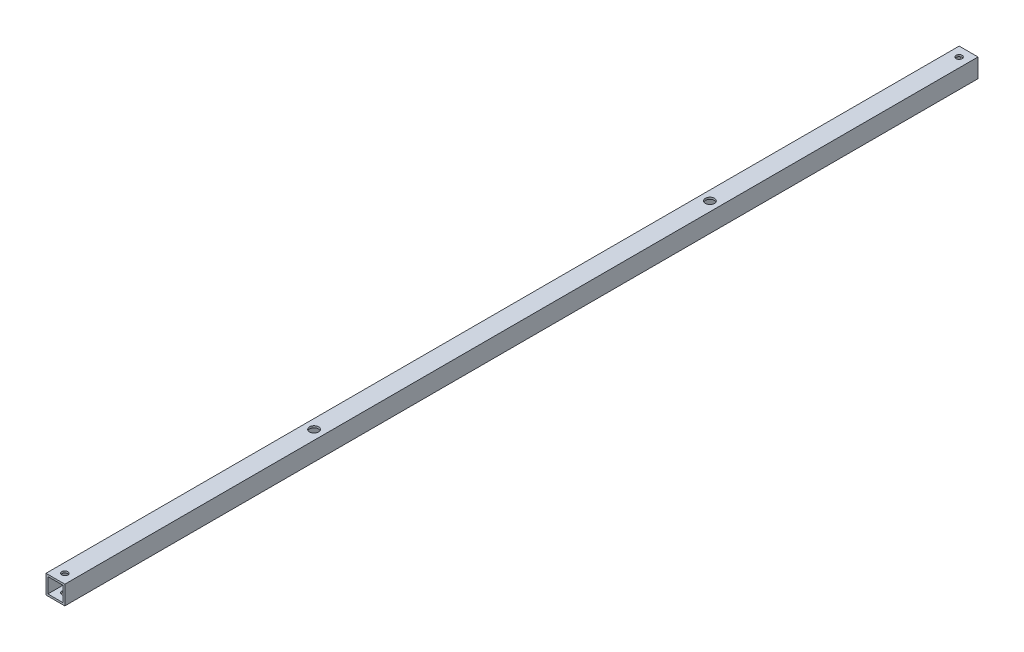
ISO-10303-21;
HEADER;
FILE_DESCRIPTION(('STEP AP214'),'2;1');
FILE_NAME('part.step','',(''),(''),'','','');
FILE_SCHEMA(('AUTOMOTIVE_DESIGN { 1 0 10303 214 1 1 1 1 }'));
ENDSEC;
DATA;
#1=APPLICATION_CONTEXT('core data for automotive mechanical design processes');
#2=APPLICATION_PROTOCOL_DEFINITION('international standard','automotive_design',2000,#1);
#3=PRODUCT_CONTEXT('',#1,'mechanical');
#4=PRODUCT('Part','Part','',(#3));
#5=PRODUCT_RELATED_PRODUCT_CATEGORY('part','',(#4));
#6=PRODUCT_DEFINITION_FORMATION('','',#4);
#7=PRODUCT_DEFINITION_CONTEXT('part definition',#1,'design');
#8=PRODUCT_DEFINITION('design','',#6,#7);
#9=PRODUCT_DEFINITION_SHAPE('','',#8);
#10=(LENGTH_UNIT() NAMED_UNIT(*) SI_UNIT(.MILLI.,.METRE.));
#11=(NAMED_UNIT(*) PLANE_ANGLE_UNIT() SI_UNIT($,.RADIAN.));
#12=(NAMED_UNIT(*) SI_UNIT($,.STERADIAN.) SOLID_ANGLE_UNIT());
#13=UNCERTAINTY_MEASURE_WITH_UNIT(LENGTH_MEASURE(1.E-05),#10,'distance_accuracy_value','');
#14=(GEOMETRIC_REPRESENTATION_CONTEXT(3) GLOBAL_UNCERTAINTY_ASSIGNED_CONTEXT((#13)) GLOBAL_UNIT_ASSIGNED_CONTEXT((#10,
#11,#12)) REPRESENTATION_CONTEXT('',''));
#15=CARTESIAN_POINT('',(0.,0.,0.));
#16=DIRECTION('',(0.,0.,1.));
#17=DIRECTION('',(1.,0.,0.));
#18=AXIS2_PLACEMENT_3D('',#15,#16,#17);
#19=CARTESIAN_POINT('',(0.,0.,0.));
#20=DIRECTION('',(0.,0.,-1.));
#21=DIRECTION('',(-1.,0.,0.));
#22=AXIS2_PLACEMENT_3D('',#19,#20,#21);
#23=PLANE('',#22);
#24=DIRECTION('',(0.,-1.,0.));
#25=VECTOR('',#24,1.);
#26=CARTESIAN_POINT('',(0.,0.,0.));
#27=LINE('',#26,#25);
#28=CARTESIAN_POINT('',(0.,10.,0.));
#29=VERTEX_POINT('',#28);
#30=CARTESIAN_POINT('',(0.,0.,0.));
#31=VERTEX_POINT('',#30);
#32=EDGE_CURVE('E110',#29,#31,#27,.T.);
#33=ORIENTED_EDGE('',*,*,#32,.F.);
#34=DIRECTION('',(-1.,0.,0.));
#35=VECTOR('',#34,1.);
#36=CARTESIAN_POINT('',(0.,10.,0.));
#37=LINE('',#36,#35);
#38=CARTESIAN_POINT('',(10.,10.,0.));
#39=VERTEX_POINT('',#38);
#40=EDGE_CURVE('E58',#39,#29,#37,.T.);
#41=ORIENTED_EDGE('',*,*,#40,.F.);
#42=DIRECTION('',(0.,1.,0.));
#43=VECTOR('',#42,1.);
#44=CARTESIAN_POINT('',(10.,0.,0.));
#45=LINE('',#44,#43);
#46=CARTESIAN_POINT('',(10.,0.,0.));
#47=VERTEX_POINT('',#46);
#48=EDGE_CURVE('E186',#47,#39,#45,.T.);
#49=ORIENTED_EDGE('',*,*,#48,.F.);
#50=DIRECTION('',(1.,0.,0.));
#51=VECTOR('',#50,1.);
#52=CARTESIAN_POINT('',(0.,0.,0.));
#53=LINE('',#52,#51);
#54=EDGE_CURVE('E184',#31,#47,#53,.T.);
#55=ORIENTED_EDGE('',*,*,#54,.F.);
#56=EDGE_LOOP('',(#33,#41,#49,#55));
#57=FACE_BOUND('',#56,.T.);
#58=DIRECTION('',(-1.,0.,0.));
#59=VECTOR('',#58,1.);
#60=CARTESIAN_POINT('',(1.,9.,0.));
#61=LINE('',#60,#59);
#62=CARTESIAN_POINT('',(9.,9.,0.));
#63=VERTEX_POINT('',#62);
#64=CARTESIAN_POINT('',(1.,9.,0.));
#65=VERTEX_POINT('',#64);
#66=EDGE_CURVE('E175',#63,#65,#61,.T.);
#67=ORIENTED_EDGE('',*,*,#66,.T.);
#68=DIRECTION('',(0.,-1.,0.));
#69=VECTOR('',#68,1.);
#70=CARTESIAN_POINT('',(1.,1.,0.));
#71=LINE('',#70,#69);
#72=CARTESIAN_POINT('',(1.,1.,0.));
#73=VERTEX_POINT('',#72);
#74=EDGE_CURVE('E50',#65,#73,#71,.T.);
#75=ORIENTED_EDGE('',*,*,#74,.T.);
#76=DIRECTION('',(1.,0.,0.));
#77=VECTOR('',#76,1.);
#78=CARTESIAN_POINT('',(1.,1.,0.));
#79=LINE('',#78,#77);
#80=CARTESIAN_POINT('',(9.,1.,0.));
#81=VERTEX_POINT('',#80);
#82=EDGE_CURVE('E109',#73,#81,#79,.T.);
#83=ORIENTED_EDGE('',*,*,#82,.T.);
#84=DIRECTION('',(0.,1.,0.));
#85=VECTOR('',#84,1.);
#86=CARTESIAN_POINT('',(9.,1.,0.));
#87=LINE('',#86,#85);
#88=EDGE_CURVE('E172',#81,#63,#87,.T.);
#89=ORIENTED_EDGE('',*,*,#88,.T.);
#90=EDGE_LOOP('',(#67,#75,#83,#89));
#91=FACE_BOUND('',#90,.T.);
#92=ADVANCED_FACE('F33',(#57,#91),#23,.T.);
#93=CARTESIAN_POINT('',(0.,0.,242.228968081884));
#94=DIRECTION('',(1.,0.,0.));
#95=DIRECTION('',(0.,0.,-1.));
#96=AXIS2_PLACEMENT_3D('',#93,#94,#95);
#97=PLANE('',#96);
#98=ORIENTED_EDGE('',*,*,#32,.T.);
#99=DIRECTION('',(0.,0.,-1.));
#100=VECTOR('',#99,1.);
#101=CARTESIAN_POINT('',(0.,0.,242.228968081884));
#102=LINE('',#101,#100);
#103=CARTESIAN_POINT('',(0.,0.,484.457936163769));
#104=VERTEX_POINT('',#103);
#105=EDGE_CURVE('E11',#104,#31,#102,.T.);
#106=ORIENTED_EDGE('',*,*,#105,.F.);
#107=DIRECTION('',(0.,-1.,0.));
#108=VECTOR('',#107,1.);
#109=CARTESIAN_POINT('',(0.,0.,484.457936163769));
#110=LINE('',#109,#108);
#111=CARTESIAN_POINT('',(0.,10.,484.457936163769));
#112=VERTEX_POINT('',#111);
#113=EDGE_CURVE('E131',#112,#104,#110,.T.);
#114=ORIENTED_EDGE('',*,*,#113,.F.);
#115=DIRECTION('',(0.,0.,-1.));
#116=VECTOR('',#115,1.);
#117=CARTESIAN_POINT('',(0.,10.,242.228968081884));
#118=LINE('',#117,#116);
#119=EDGE_CURVE('E189',#112,#29,#118,.T.);
#120=ORIENTED_EDGE('',*,*,#119,.T.);
#121=EDGE_LOOP('',(#98,#106,#114,#120));
#122=FACE_BOUND('',#121,.T.);
#123=ADVANCED_FACE('F35',(#122),#97,.F.);
#124=CARTESIAN_POINT('',(0.,0.,242.228968081884));
#125=DIRECTION('',(0.,1.,0.));
#126=DIRECTION('',(0.,0.,1.));
#127=AXIS2_PLACEMENT_3D('',#124,#125,#126);
#128=PLANE('',#127);
#129=CARTESIAN_POINT('',(5.,0.,5.));
#130=DIRECTION('',(0.,1.,0.));
#131=DIRECTION('',(0.,0.,1.));
#132=AXIS2_PLACEMENT_3D('',#129,#130,#131);
#133=CIRCLE('',#132,1.6);
#134=CARTESIAN_POINT('',(5.,0.,6.6));
#135=VERTEX_POINT('',#134);
#136=EDGE_CURVE('E152',#135,#135,#133,.T.);
#137=ORIENTED_EDGE('',*,*,#136,.T.);
#138=EDGE_LOOP('',(#137));
#139=FACE_BOUND('',#138,.T.);
#140=CARTESIAN_POINT('',(5.,0.,137.228968081884));
#141=DIRECTION('',(0.,1.,0.));
#142=DIRECTION('',(0.,0.,1.));
#143=AXIS2_PLACEMENT_3D('',#140,#141,#142);
#144=CIRCLE('',#143,2.40000000000001);
#145=CARTESIAN_POINT('',(5.,0.,139.628968081884));
#146=VERTEX_POINT('',#145);
#147=EDGE_CURVE('E159',#146,#146,#144,.T.);
#148=ORIENTED_EDGE('',*,*,#147,.T.);
#149=EDGE_LOOP('',(#148));
#150=FACE_BOUND('',#149,.T.);
#151=ORIENTED_EDGE('',*,*,#54,.T.);
#152=DIRECTION('',(0.,0.,-1.));
#153=VECTOR('',#152,1.);
#154=CARTESIAN_POINT('',(10.,0.,242.228968081884));
#155=LINE('',#154,#153);
#156=CARTESIAN_POINT('',(10.,0.,484.457936163769));
#157=VERTEX_POINT('',#156);
#158=EDGE_CURVE('E42',#157,#47,#155,.T.);
#159=ORIENTED_EDGE('',*,*,#158,.F.);
#160=DIRECTION('',(1.,0.,0.));
#161=VECTOR('',#160,1.);
#162=CARTESIAN_POINT('',(0.,0.,484.457936163769));
#163=LINE('',#162,#161);
#164=EDGE_CURVE('E134',#104,#157,#163,.T.);
#165=ORIENTED_EDGE('',*,*,#164,.F.);
#166=ORIENTED_EDGE('',*,*,#105,.T.);
#167=EDGE_LOOP('',(#151,#159,#165,#166));
#168=FACE_BOUND('',#167,.T.);
#169=CARTESIAN_POINT('',(5.,0.,479.457936163769));
#170=DIRECTION('',(0.,-1.,0.));
#171=DIRECTION('',(0.,0.,-1.));
#172=AXIS2_PLACEMENT_3D('',#169,#170,#171);
#173=CIRCLE('',#172,1.6);
#174=CARTESIAN_POINT('',(5.,0.,477.857936163769));
#175=VERTEX_POINT('',#174);
#176=EDGE_CURVE('E148',#175,#175,#173,.T.);
#177=ORIENTED_EDGE('',*,*,#176,.F.);
#178=EDGE_LOOP('',(#177));
#179=FACE_BOUND('',#178,.T.);
#180=CARTESIAN_POINT('',(5.,0.,347.228968081884));
#181=DIRECTION('',(0.,-1.,0.));
#182=DIRECTION('',(0.,0.,-1.));
#183=AXIS2_PLACEMENT_3D('',#180,#181,#182);
#184=CIRCLE('',#183,2.40000000000001);
#185=CARTESIAN_POINT('',(5.,0.,344.828968081884));
#186=VERTEX_POINT('',#185);
#187=EDGE_CURVE('E222',#186,#186,#184,.T.);
#188=ORIENTED_EDGE('',*,*,#187,.F.);
#189=EDGE_LOOP('',(#188));
#190=FACE_BOUND('',#189,.T.);
#191=ADVANCED_FACE('F259',(#139,#150,#168,#179,#190),#128,.F.);
#192=CARTESIAN_POINT('',(10.,0.,242.228968081884));
#193=DIRECTION('',(-1.,0.,0.));
#194=DIRECTION('',(0.,0.,1.));
#195=AXIS2_PLACEMENT_3D('',#192,#193,#194);
#196=PLANE('',#195);
#197=ORIENTED_EDGE('',*,*,#48,.T.);
#198=DIRECTION('',(0.,0.,-1.));
#199=VECTOR('',#198,1.);
#200=CARTESIAN_POINT('',(10.,10.,242.228968081884));
#201=LINE('',#200,#199);
#202=CARTESIAN_POINT('',(10.,10.,484.457936163769));
#203=VERTEX_POINT('',#202);
#204=EDGE_CURVE('E191',#203,#39,#201,.T.);
#205=ORIENTED_EDGE('',*,*,#204,.F.);
#206=DIRECTION('',(0.,1.,0.));
#207=VECTOR('',#206,1.);
#208=CARTESIAN_POINT('',(10.,0.,484.457936163769));
#209=LINE('',#208,#207);
#210=EDGE_CURVE('E137',#157,#203,#209,.T.);
#211=ORIENTED_EDGE('',*,*,#210,.F.);
#212=ORIENTED_EDGE('',*,*,#158,.T.);
#213=EDGE_LOOP('',(#197,#205,#211,#212));
#214=FACE_BOUND('',#213,.T.);
#215=ADVANCED_FACE('F268',(#214),#196,.F.);
#216=CARTESIAN_POINT('',(0.,10.,242.228968081884));
#217=DIRECTION('',(0.,-1.,0.));
#218=DIRECTION('',(0.,0.,-1.));
#219=AXIS2_PLACEMENT_3D('',#216,#217,#218);
#220=PLANE('',#219);
#221=CARTESIAN_POINT('',(5.,10.,5.));
#222=DIRECTION('',(0.,1.,0.));
#223=DIRECTION('',(0.,0.,1.));
#224=AXIS2_PLACEMENT_3D('',#221,#222,#223);
#225=CIRCLE('',#224,1.6);
#226=CARTESIAN_POINT('',(5.,10.,6.6));
#227=VERTEX_POINT('',#226);
#228=EDGE_CURVE('E156',#227,#227,#225,.T.);
#229=ORIENTED_EDGE('',*,*,#228,.F.);
#230=EDGE_LOOP('',(#229));
#231=FACE_BOUND('',#230,.T.);
#232=CARTESIAN_POINT('',(5.,10.,137.228968081884));
#233=DIRECTION('',(0.,1.,0.));
#234=DIRECTION('',(0.,0.,1.));
#235=AXIS2_PLACEMENT_3D('',#232,#233,#234);
#236=CIRCLE('',#235,2.40000000000001);
#237=CARTESIAN_POINT('',(5.,10.,139.628968081884));
#238=VERTEX_POINT('',#237);
#239=EDGE_CURVE('E143',#238,#238,#236,.T.);
#240=ORIENTED_EDGE('',*,*,#239,.F.);
#241=EDGE_LOOP('',(#240));
#242=FACE_BOUND('',#241,.T.);
#243=ORIENTED_EDGE('',*,*,#40,.T.);
#244=ORIENTED_EDGE('',*,*,#119,.F.);
#245=DIRECTION('',(-1.,0.,0.));
#246=VECTOR('',#245,1.);
#247=CARTESIAN_POINT('',(0.,10.,484.457936163769));
#248=LINE('',#247,#246);
#249=EDGE_CURVE('E140',#203,#112,#248,.T.);
#250=ORIENTED_EDGE('',*,*,#249,.F.);
#251=ORIENTED_EDGE('',*,*,#204,.T.);
#252=EDGE_LOOP('',(#243,#244,#250,#251));
#253=FACE_BOUND('',#252,.T.);
#254=CARTESIAN_POINT('',(5.,10.,479.457936163769));
#255=DIRECTION('',(0.,-1.,0.));
#256=DIRECTION('',(0.,0.,-1.));
#257=AXIS2_PLACEMENT_3D('',#254,#255,#256);
#258=CIRCLE('',#257,1.6);
#259=CARTESIAN_POINT('',(5.,10.,477.857936163769));
#260=VERTEX_POINT('',#259);
#261=EDGE_CURVE('E225',#260,#260,#258,.T.);
#262=ORIENTED_EDGE('',*,*,#261,.T.);
#263=EDGE_LOOP('',(#262));
#264=FACE_BOUND('',#263,.T.);
#265=CARTESIAN_POINT('',(5.,10.,347.228968081884));
#266=DIRECTION('',(0.,-1.,0.));
#267=DIRECTION('',(0.,0.,-1.));
#268=AXIS2_PLACEMENT_3D('',#265,#266,#267);
#269=CIRCLE('',#268,2.40000000000001);
#270=CARTESIAN_POINT('',(5.,10.,344.828968081884));
#271=VERTEX_POINT('',#270);
#272=EDGE_CURVE('E220',#271,#271,#269,.T.);
#273=ORIENTED_EDGE('',*,*,#272,.T.);
#274=EDGE_LOOP('',(#273));
#275=FACE_BOUND('',#274,.T.);
#276=ADVANCED_FACE('F245',(#231,#242,#253,#264,#275),#220,.F.);
#277=CARTESIAN_POINT('',(1.,1.,242.228968081884));
#278=DIRECTION('',(1.,0.,0.));
#279=DIRECTION('',(0.,0.,-1.));
#280=AXIS2_PLACEMENT_3D('',#277,#278,#279);
#281=PLANE('',#280);
#282=ORIENTED_EDGE('',*,*,#74,.F.);
#283=DIRECTION('',(0.,0.,-1.));
#284=VECTOR('',#283,1.);
#285=CARTESIAN_POINT('',(1.,9.,242.228968081884));
#286=LINE('',#285,#284);
#287=CARTESIAN_POINT('',(1.,9.,484.457936163769));
#288=VERTEX_POINT('',#287);
#289=EDGE_CURVE('E116',#288,#65,#286,.T.);
#290=ORIENTED_EDGE('',*,*,#289,.F.);
#291=DIRECTION('',(0.,-1.,0.));
#292=VECTOR('',#291,1.);
#293=CARTESIAN_POINT('',(1.,1.,484.457936163769));
#294=LINE('',#293,#292);
#295=CARTESIAN_POINT('',(1.,1.,484.457936163769));
#296=VERTEX_POINT('',#295);
#297=EDGE_CURVE('E114',#288,#296,#294,.T.);
#298=ORIENTED_EDGE('',*,*,#297,.T.);
#299=DIRECTION('',(0.,0.,-1.));
#300=VECTOR('',#299,1.);
#301=CARTESIAN_POINT('',(1.,1.,242.228968081884));
#302=LINE('',#301,#300);
#303=EDGE_CURVE('E101',#296,#73,#302,.T.);
#304=ORIENTED_EDGE('',*,*,#303,.T.);
#305=EDGE_LOOP('',(#282,#290,#298,#304));
#306=FACE_BOUND('',#305,.T.);
#307=ADVANCED_FACE('F115',(#306),#281,.T.);
#308=CARTESIAN_POINT('',(1.,1.,242.228968081884));
#309=DIRECTION('',(0.,1.,0.));
#310=DIRECTION('',(0.,0.,1.));
#311=AXIS2_PLACEMENT_3D('',#308,#309,#310);
#312=PLANE('',#311);
#313=CARTESIAN_POINT('',(5.,1.,5.));
#314=DIRECTION('',(0.,1.,0.));
#315=DIRECTION('',(0.,0.,1.));
#316=AXIS2_PLACEMENT_3D('',#313,#314,#315);
#317=CIRCLE('',#316,1.6);
#318=CARTESIAN_POINT('',(5.,1.,6.6));
#319=VERTEX_POINT('',#318);
#320=EDGE_CURVE('E167',#319,#319,#317,.T.);
#321=ORIENTED_EDGE('',*,*,#320,.F.);
#322=EDGE_LOOP('',(#321));
#323=FACE_BOUND('',#322,.T.);
#324=CARTESIAN_POINT('',(5.,1.,137.228968081884));
#325=DIRECTION('',(0.,1.,0.));
#326=DIRECTION('',(0.,0.,1.));
#327=AXIS2_PLACEMENT_3D('',#324,#325,#326);
#328=CIRCLE('',#327,2.40000000000001);
#329=CARTESIAN_POINT('',(5.,1.,139.628968081884));
#330=VERTEX_POINT('',#329);
#331=EDGE_CURVE('E164',#330,#330,#328,.T.);
#332=ORIENTED_EDGE('',*,*,#331,.F.);
#333=EDGE_LOOP('',(#332));
#334=FACE_BOUND('',#333,.T.);
#335=ORIENTED_EDGE('',*,*,#82,.F.);
#336=ORIENTED_EDGE('',*,*,#303,.F.);
#337=DIRECTION('',(1.,0.,0.));
#338=VECTOR('',#337,1.);
#339=CARTESIAN_POINT('',(1.,1.,484.457936163769));
#340=LINE('',#339,#338);
#341=CARTESIAN_POINT('',(9.,1.,484.457936163769));
#342=VERTEX_POINT('',#341);
#343=EDGE_CURVE('E106',#296,#342,#340,.T.);
#344=ORIENTED_EDGE('',*,*,#343,.T.);
#345=DIRECTION('',(0.,0.,-1.));
#346=VECTOR('',#345,1.);
#347=CARTESIAN_POINT('',(9.,1.,242.228968081884));
#348=LINE('',#347,#346);
#349=EDGE_CURVE('E111',#342,#81,#348,.T.);
#350=ORIENTED_EDGE('',*,*,#349,.T.);
#351=EDGE_LOOP('',(#335,#336,#344,#350));
#352=FACE_BOUND('',#351,.T.);
#353=CARTESIAN_POINT('',(5.,1.,479.457936163769));
#354=DIRECTION('',(0.,-1.,0.));
#355=DIRECTION('',(0.,0.,-1.));
#356=AXIS2_PLACEMENT_3D('',#353,#354,#355);
#357=CIRCLE('',#356,1.6);
#358=CARTESIAN_POINT('',(5.,1.,477.857936163769));
#359=VERTEX_POINT('',#358);
#360=EDGE_CURVE('E120',#359,#359,#357,.T.);
#361=ORIENTED_EDGE('',*,*,#360,.T.);
#362=EDGE_LOOP('',(#361));
#363=FACE_BOUND('',#362,.T.);
#364=CARTESIAN_POINT('',(5.,1.,347.228968081884));
#365=DIRECTION('',(0.,-1.,0.));
#366=DIRECTION('',(0.,0.,-1.));
#367=AXIS2_PLACEMENT_3D('',#364,#365,#366);
#368=CIRCLE('',#367,2.40000000000001);
#369=CARTESIAN_POINT('',(5.,1.,344.828968081884));
#370=VERTEX_POINT('',#369);
#371=EDGE_CURVE('E147',#370,#370,#368,.T.);
#372=ORIENTED_EDGE('',*,*,#371,.T.);
#373=EDGE_LOOP('',(#372));
#374=FACE_BOUND('',#373,.T.);
#375=ADVANCED_FACE('F103',(#323,#334,#352,#363,#374),#312,.T.);
#376=CARTESIAN_POINT('',(9.,1.,242.228968081884));
#377=DIRECTION('',(-1.,0.,0.));
#378=DIRECTION('',(0.,0.,1.));
#379=AXIS2_PLACEMENT_3D('',#376,#377,#378);
#380=PLANE('',#379);
#381=ORIENTED_EDGE('',*,*,#88,.F.);
#382=ORIENTED_EDGE('',*,*,#349,.F.);
#383=DIRECTION('',(0.,1.,0.));
#384=VECTOR('',#383,1.);
#385=CARTESIAN_POINT('',(9.,1.,484.457936163769));
#386=LINE('',#385,#384);
#387=CARTESIAN_POINT('',(9.,9.,484.457936163769));
#388=VERTEX_POINT('',#387);
#389=EDGE_CURVE('E124',#342,#388,#386,.T.);
#390=ORIENTED_EDGE('',*,*,#389,.T.);
#391=DIRECTION('',(0.,0.,-1.));
#392=VECTOR('',#391,1.);
#393=CARTESIAN_POINT('',(9.,9.,242.228968081884));
#394=LINE('',#393,#392);
#395=EDGE_CURVE('E179',#388,#63,#394,.T.);
#396=ORIENTED_EDGE('',*,*,#395,.T.);
#397=EDGE_LOOP('',(#381,#382,#390,#396));
#398=FACE_BOUND('',#397,.T.);
#399=ADVANCED_FACE('F203',(#398),#380,.T.);
#400=CARTESIAN_POINT('',(1.,9.,242.228968081884));
#401=DIRECTION('',(0.,-1.,0.));
#402=DIRECTION('',(0.,0.,-1.));
#403=AXIS2_PLACEMENT_3D('',#400,#401,#402);
#404=PLANE('',#403);
#405=CARTESIAN_POINT('',(5.,9.,5.));
#406=DIRECTION('',(0.,-1.,0.));
#407=DIRECTION('',(0.,0.,-1.));
#408=AXIS2_PLACEMENT_3D('',#405,#406,#407);
#409=CIRCLE('',#408,1.6);
#410=CARTESIAN_POINT('',(5.,9.,3.40000000000001));
#411=VERTEX_POINT('',#410);
#412=EDGE_CURVE('E37',#411,#411,#409,.T.);
#413=ORIENTED_EDGE('',*,*,#412,.F.);
#414=EDGE_LOOP('',(#413));
#415=FACE_BOUND('',#414,.T.);
#416=CARTESIAN_POINT('',(5.,9.,137.228968081884));
#417=DIRECTION('',(0.,-1.,0.));
#418=DIRECTION('',(0.,0.,-1.));
#419=AXIS2_PLACEMENT_3D('',#416,#417,#418);
#420=CIRCLE('',#419,2.40000000000001);
#421=CARTESIAN_POINT('',(5.,9.,134.828968081884));
#422=VERTEX_POINT('',#421);
#423=EDGE_CURVE('E155',#422,#422,#420,.T.);
#424=ORIENTED_EDGE('',*,*,#423,.F.);
#425=EDGE_LOOP('',(#424));
#426=FACE_BOUND('',#425,.T.);
#427=ORIENTED_EDGE('',*,*,#66,.F.);
#428=ORIENTED_EDGE('',*,*,#395,.F.);
#429=DIRECTION('',(-1.,0.,0.));
#430=VECTOR('',#429,1.);
#431=CARTESIAN_POINT('',(1.,9.,484.457936163769));
#432=LINE('',#431,#430);
#433=EDGE_CURVE('E126',#388,#288,#432,.T.);
#434=ORIENTED_EDGE('',*,*,#433,.T.);
#435=ORIENTED_EDGE('',*,*,#289,.T.);
#436=EDGE_LOOP('',(#427,#428,#434,#435));
#437=FACE_BOUND('',#436,.T.);
#438=CARTESIAN_POINT('',(5.,9.,479.457936163769));
#439=DIRECTION('',(0.,1.,0.));
#440=DIRECTION('',(0.,0.,1.));
#441=AXIS2_PLACEMENT_3D('',#438,#439,#440);
#442=CIRCLE('',#441,1.6);
#443=CARTESIAN_POINT('',(5.,9.,481.057936163769));
#444=VERTEX_POINT('',#443);
#445=EDGE_CURVE('E149',#444,#444,#442,.T.);
#446=ORIENTED_EDGE('',*,*,#445,.T.);
#447=EDGE_LOOP('',(#446));
#448=FACE_BOUND('',#447,.T.);
#449=CARTESIAN_POINT('',(5.,9.,347.228968081884));
#450=DIRECTION('',(0.,1.,0.));
#451=DIRECTION('',(0.,0.,1.));
#452=AXIS2_PLACEMENT_3D('',#449,#450,#451);
#453=CIRCLE('',#452,2.40000000000001);
#454=CARTESIAN_POINT('',(5.,9.,349.628968081884));
#455=VERTEX_POINT('',#454);
#456=EDGE_CURVE('E144',#455,#455,#453,.T.);
#457=ORIENTED_EDGE('',*,*,#456,.T.);
#458=EDGE_LOOP('',(#457));
#459=FACE_BOUND('',#458,.T.);
#460=ADVANCED_FACE('F200',(#415,#426,#437,#448,#459),#404,.T.);
#461=CARTESIAN_POINT('',(5.,0.,137.228968081884));
#462=DIRECTION('',(0.,1.,0.));
#463=DIRECTION('',(0.,0.,1.));
#464=AXIS2_PLACEMENT_3D('',#461,#462,#463);
#465=CYLINDRICAL_SURFACE('',#464,2.40000000000001);
#466=ORIENTED_EDGE('',*,*,#423,.T.);
#467=EDGE_LOOP('',(#466));
#468=FACE_BOUND('',#467,.T.);
#469=ORIENTED_EDGE('',*,*,#239,.T.);
#470=EDGE_LOOP('',(#469));
#471=FACE_BOUND('',#470,.T.);
#472=ADVANCED_FACE('F197',(#468,#471),#465,.F.);
#473=CARTESIAN_POINT('',(5.,0.,5.));
#474=DIRECTION('',(0.,1.,0.));
#475=DIRECTION('',(0.,0.,1.));
#476=AXIS2_PLACEMENT_3D('',#473,#474,#475);
#477=CYLINDRICAL_SURFACE('',#476,1.6);
#478=ORIENTED_EDGE('',*,*,#412,.T.);
#479=EDGE_LOOP('',(#478));
#480=FACE_BOUND('',#479,.T.);
#481=ORIENTED_EDGE('',*,*,#228,.T.);
#482=EDGE_LOOP('',(#481));
#483=FACE_BOUND('',#482,.T.);
#484=ADVANCED_FACE('F298',(#480,#483),#477,.F.);
#485=ORIENTED_EDGE('',*,*,#331,.T.);
#486=EDGE_LOOP('',(#485));
#487=FACE_BOUND('',#486,.T.);
#488=ORIENTED_EDGE('',*,*,#147,.F.);
#489=EDGE_LOOP('',(#488));
#490=FACE_BOUND('',#489,.T.);
#491=ADVANCED_FACE('F295',(#487,#490),#465,.F.);
#492=ORIENTED_EDGE('',*,*,#320,.T.);
#493=EDGE_LOOP('',(#492));
#494=FACE_BOUND('',#493,.T.);
#495=ORIENTED_EDGE('',*,*,#136,.F.);
#496=EDGE_LOOP('',(#495));
#497=FACE_BOUND('',#496,.T.);
#498=ADVANCED_FACE('F290',(#494,#497),#477,.F.);
#499=CARTESIAN_POINT('',(0.,0.,484.457936163769));
#500=DIRECTION('',(0.,0.,1.));
#501=DIRECTION('',(-1.,0.,0.));
#502=AXIS2_PLACEMENT_3D('',#499,#500,#501);
#503=PLANE('',#502);
#504=ORIENTED_EDGE('',*,*,#113,.T.);
#505=ORIENTED_EDGE('',*,*,#164,.T.);
#506=ORIENTED_EDGE('',*,*,#210,.T.);
#507=ORIENTED_EDGE('',*,*,#249,.T.);
#508=EDGE_LOOP('',(#504,#505,#506,#507));
#509=FACE_BOUND('',#508,.T.);
#510=ORIENTED_EDGE('',*,*,#433,.F.);
#511=ORIENTED_EDGE('',*,*,#389,.F.);
#512=ORIENTED_EDGE('',*,*,#343,.F.);
#513=ORIENTED_EDGE('',*,*,#297,.F.);
#514=EDGE_LOOP('',(#510,#511,#512,#513));
#515=FACE_BOUND('',#514,.T.);
#516=ADVANCED_FACE('F122',(#509,#515),#503,.T.);
#517=CARTESIAN_POINT('',(5.,0.,347.228968081884));
#518=DIRECTION('',(0.,1.,0.));
#519=DIRECTION('',(0.,0.,-1.));
#520=AXIS2_PLACEMENT_3D('',#517,#518,#519);
#521=CYLINDRICAL_SURFACE('',#520,2.40000000000001);
#522=ORIENTED_EDGE('',*,*,#456,.F.);
#523=EDGE_LOOP('',(#522));
#524=FACE_BOUND('',#523,.T.);
#525=ORIENTED_EDGE('',*,*,#272,.F.);
#526=EDGE_LOOP('',(#525));
#527=FACE_BOUND('',#526,.T.);
#528=ADVANCED_FACE('F212',(#524,#527),#521,.F.);
#529=CARTESIAN_POINT('',(5.,0.,479.457936163769));
#530=DIRECTION('',(0.,1.,0.));
#531=DIRECTION('',(0.,0.,-1.));
#532=AXIS2_PLACEMENT_3D('',#529,#530,#531);
#533=CYLINDRICAL_SURFACE('',#532,1.6);
#534=ORIENTED_EDGE('',*,*,#445,.F.);
#535=EDGE_LOOP('',(#534));
#536=FACE_BOUND('',#535,.T.);
#537=ORIENTED_EDGE('',*,*,#261,.F.);
#538=EDGE_LOOP('',(#537));
#539=FACE_BOUND('',#538,.T.);
#540=ADVANCED_FACE('F215',(#536,#539),#533,.F.);
#541=ORIENTED_EDGE('',*,*,#371,.F.);
#542=EDGE_LOOP('',(#541));
#543=FACE_BOUND('',#542,.T.);
#544=ORIENTED_EDGE('',*,*,#187,.T.);
#545=EDGE_LOOP('',(#544));
#546=FACE_BOUND('',#545,.T.);
#547=ADVANCED_FACE('F217',(#543,#546),#521,.F.);
#548=ORIENTED_EDGE('',*,*,#360,.F.);
#549=EDGE_LOOP('',(#548));
#550=FACE_BOUND('',#549,.T.);
#551=ORIENTED_EDGE('',*,*,#176,.T.);
#552=EDGE_LOOP('',(#551));
#553=FACE_BOUND('',#552,.T.);
#554=ADVANCED_FACE('F234',(#550,#553),#533,.F.);
#555=CLOSED_SHELL('',(#92,#123,#191,#215,#276,#307,#375,#399,#460,#472,#484,#491,#498,#516,#528,
#540,#547,#554));
#556=MANIFOLD_SOLID_BREP('B2',#555);
#557=ADVANCED_BREP_SHAPE_REPRESENTATION('',(#18,#556),#14);
#558=SHAPE_DEFINITION_REPRESENTATION(#9,#557);
ENDSEC;
END-ISO-10303-21;
